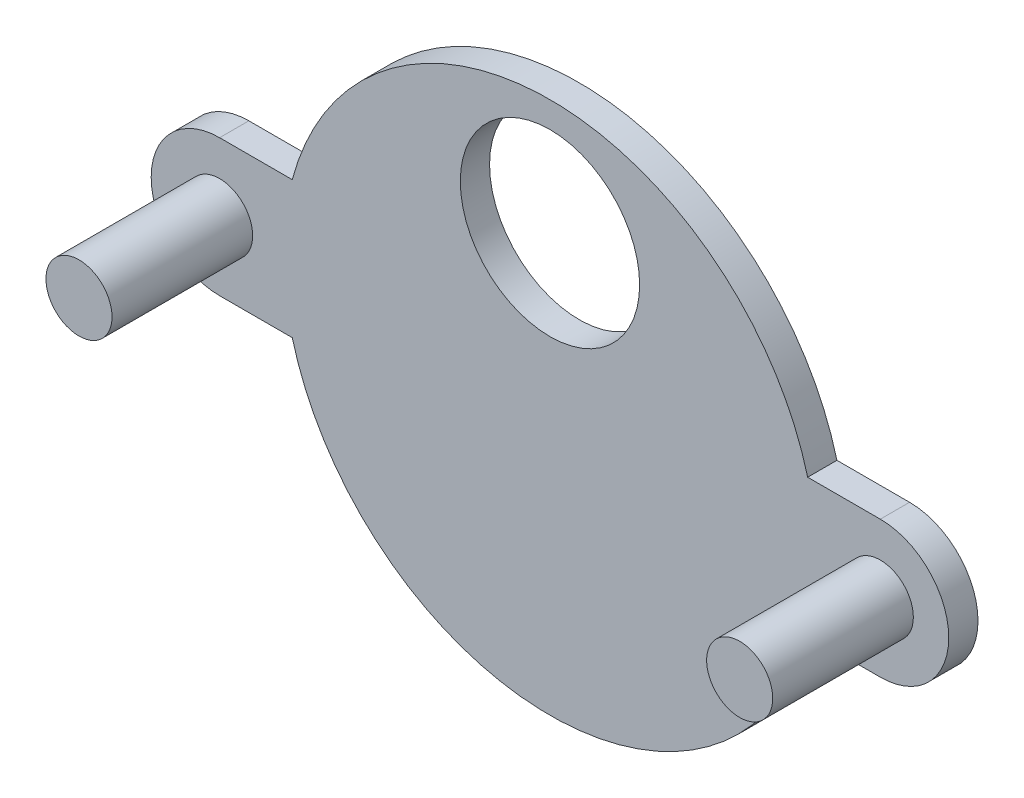
ISO-10303-21;
HEADER;
FILE_DESCRIPTION(('STEP AP214'),'2;1');
FILE_NAME('part.step','',(''),(''),'','','');
FILE_SCHEMA(('AUTOMOTIVE_DESIGN { 1 0 10303 214 1 1 1 1 }'));
ENDSEC;
DATA;
#1=APPLICATION_CONTEXT('core data for automotive mechanical design processes');
#2=APPLICATION_PROTOCOL_DEFINITION('international standard','automotive_design',2000,#1);
#3=PRODUCT_CONTEXT('',#1,'mechanical');
#4=PRODUCT('Part','Part','',(#3));
#5=PRODUCT_RELATED_PRODUCT_CATEGORY('part','',(#4));
#6=PRODUCT_DEFINITION_FORMATION('','',#4);
#7=PRODUCT_DEFINITION_CONTEXT('part definition',#1,'design');
#8=PRODUCT_DEFINITION('design','',#6,#7);
#9=PRODUCT_DEFINITION_SHAPE('','',#8);
#10=(LENGTH_UNIT() NAMED_UNIT(*) SI_UNIT(.MILLI.,.METRE.));
#11=(NAMED_UNIT(*) PLANE_ANGLE_UNIT() SI_UNIT($,.RADIAN.));
#12=(NAMED_UNIT(*) SI_UNIT($,.STERADIAN.) SOLID_ANGLE_UNIT());
#13=UNCERTAINTY_MEASURE_WITH_UNIT(LENGTH_MEASURE(1.E-05),#10,'distance_accuracy_value','');
#14=(GEOMETRIC_REPRESENTATION_CONTEXT(3) GLOBAL_UNCERTAINTY_ASSIGNED_CONTEXT((#13)) GLOBAL_UNIT_ASSIGNED_CONTEXT((#10,
#11,#12)) REPRESENTATION_CONTEXT('',''));
#15=CARTESIAN_POINT('',(0.,0.,0.));
#16=DIRECTION('',(0.,0.,1.));
#17=DIRECTION('',(1.,0.,0.));
#18=AXIS2_PLACEMENT_3D('',#15,#16,#17);
#19=CARTESIAN_POINT('',(0.,0.,1.55));
#20=DIRECTION('',(0.,0.,-1.));
#21=DIRECTION('',(-1.,0.,0.));
#22=AXIS2_PLACEMENT_3D('',#19,#20,#21);
#23=CYLINDRICAL_SURFACE('',#22,14.125);
#24=DIRECTION('',(0.,0.,-1.));
#25=VECTOR('',#24,1.);
#26=CARTESIAN_POINT('',(13.651922941476,-3.625,1.55));
#27=LINE('',#26,#25);
#28=CARTESIAN_POINT('',(13.651922941476,-3.625,1.55));
#29=VERTEX_POINT('',#28);
#30=CARTESIAN_POINT('',(13.651922941476,-3.625,0.));
#31=VERTEX_POINT('',#30);
#32=EDGE_CURVE('E147',#29,#31,#27,.T.);
#33=ORIENTED_EDGE('',*,*,#32,.F.);
#34=CARTESIAN_POINT('',(0.,0.,1.55));
#35=DIRECTION('',(0.,0.,1.));
#36=DIRECTION('',(1.,0.,0.));
#37=AXIS2_PLACEMENT_3D('',#34,#35,#36);
#38=CIRCLE('',#37,14.125);
#39=CARTESIAN_POINT('',(-13.651922941476,-3.625,1.55));
#40=VERTEX_POINT('',#39);
#41=EDGE_CURVE('E47',#40,#29,#38,.T.);
#42=ORIENTED_EDGE('',*,*,#41,.F.);
#43=DIRECTION('',(0.,0.,-1.));
#44=VECTOR('',#43,1.);
#45=CARTESIAN_POINT('',(-13.651922941476,-3.625,1.55));
#46=LINE('',#45,#44);
#47=CARTESIAN_POINT('',(-13.651922941476,-3.625,0.));
#48=VERTEX_POINT('',#47);
#49=EDGE_CURVE('E145',#48,#40,#46,.F.);
#50=ORIENTED_EDGE('',*,*,#49,.F.);
#51=CARTESIAN_POINT('',(0.,0.,0.));
#52=DIRECTION('',(0.,0.,1.));
#53=DIRECTION('',(1.,0.,0.));
#54=AXIS2_PLACEMENT_3D('',#51,#52,#53);
#55=CIRCLE('',#54,14.125);
#56=EDGE_CURVE('E148',#48,#31,#55,.T.);
#57=ORIENTED_EDGE('',*,*,#56,.T.);
#58=EDGE_LOOP('',(#33,#42,#50,#57));
#59=FACE_BOUND('',#58,.T.);
#60=ADVANCED_FACE('F39',(#59),#23,.T.);
#61=DIRECTION('',(0.,0.,-1.));
#62=VECTOR('',#61,1.);
#63=CARTESIAN_POINT('',(-13.651922941476,3.625,1.55));
#64=LINE('',#63,#62);
#65=CARTESIAN_POINT('',(-13.651922941476,3.625,1.55));
#66=VERTEX_POINT('',#65);
#67=CARTESIAN_POINT('',(-13.651922941476,3.625,0.));
#68=VERTEX_POINT('',#67);
#69=EDGE_CURVE('E126',#66,#68,#64,.T.);
#70=ORIENTED_EDGE('',*,*,#69,.F.);
#71=CARTESIAN_POINT('',(13.651922941476,3.625,1.55));
#72=VERTEX_POINT('',#71);
#73=EDGE_CURVE('E11',#72,#66,#38,.T.);
#74=ORIENTED_EDGE('',*,*,#73,.F.);
#75=DIRECTION('',(0.,0.,-1.));
#76=VECTOR('',#75,1.);
#77=CARTESIAN_POINT('',(13.651922941476,3.625,1.55));
#78=LINE('',#77,#76);
#79=CARTESIAN_POINT('',(13.651922941476,3.625,0.));
#80=VERTEX_POINT('',#79);
#81=EDGE_CURVE('E118',#80,#72,#78,.F.);
#82=ORIENTED_EDGE('',*,*,#81,.F.);
#83=EDGE_CURVE('E42',#80,#68,#55,.T.);
#84=ORIENTED_EDGE('',*,*,#83,.T.);
#85=EDGE_LOOP('',(#70,#74,#82,#84));
#86=FACE_BOUND('',#85,.T.);
#87=ADVANCED_FACE('F198',(#86),#23,.T.);
#88=CARTESIAN_POINT('',(0.,0.,1.55));
#89=DIRECTION('',(0.,0.,1.));
#90=DIRECTION('',(1.,0.,0.));
#91=AXIS2_PLACEMENT_3D('',#88,#89,#90);
#92=PLANE('',#91);
#93=CARTESIAN_POINT('',(0.,8.,1.55));
#94=DIRECTION('',(0.,0.,1.));
#95=DIRECTION('',(1.,0.,0.));
#96=AXIS2_PLACEMENT_3D('',#93,#94,#95);
#97=CIRCLE('',#96,4.75);
#98=CARTESIAN_POINT('',(4.75,8.,1.55));
#99=VERTEX_POINT('',#98);
#100=EDGE_CURVE('E183',#99,#99,#97,.F.);
#101=ORIENTED_EDGE('',*,*,#100,.T.);
#102=EDGE_LOOP('',(#101));
#103=FACE_BOUND('',#102,.T.);
#104=CARTESIAN_POINT('',(-17.5,0.,1.55));
#105=DIRECTION('',(0.,0.,1.));
#106=DIRECTION('',(1.,0.,0.));
#107=AXIS2_PLACEMENT_3D('',#104,#105,#106);
#108=CIRCLE('',#107,1.75);
#109=CARTESIAN_POINT('',(-15.75,0.,1.55));
#110=VERTEX_POINT('',#109);
#111=EDGE_CURVE('E142',#110,#110,#108,.F.);
#112=ORIENTED_EDGE('',*,*,#111,.T.);
#113=EDGE_LOOP('',(#112));
#114=FACE_BOUND('',#113,.T.);
#115=CARTESIAN_POINT('',(17.5,0.,1.55));
#116=DIRECTION('',(0.,0.,1.));
#117=DIRECTION('',(1.,0.,0.));
#118=AXIS2_PLACEMENT_3D('',#115,#116,#117);
#119=CIRCLE('',#118,1.75);
#120=CARTESIAN_POINT('',(19.25,0.,1.55));
#121=VERTEX_POINT('',#120);
#122=EDGE_CURVE('E173',#121,#121,#119,.F.);
#123=ORIENTED_EDGE('',*,*,#122,.T.);
#124=EDGE_LOOP('',(#123));
#125=FACE_BOUND('',#124,.T.);
#126=ORIENTED_EDGE('',*,*,#73,.T.);
#127=DIRECTION('',(-1.,0.,0.));
#128=VECTOR('',#127,1.);
#129=CARTESIAN_POINT('',(-17.5,3.625,1.55));
#130=LINE('',#129,#128);
#131=CARTESIAN_POINT('',(-17.5,3.625,1.55));
#132=VERTEX_POINT('',#131);
#133=EDGE_CURVE('E121',#66,#132,#130,.T.);
#134=ORIENTED_EDGE('',*,*,#133,.T.);
#135=CARTESIAN_POINT('',(-17.5,0.,1.55));
#136=DIRECTION('',(0.,0.,1.));
#137=DIRECTION('',(1.,0.,0.));
#138=AXIS2_PLACEMENT_3D('',#135,#136,#137);
#139=CIRCLE('',#138,3.625);
#140=CARTESIAN_POINT('',(-17.5,-3.625,1.55));
#141=VERTEX_POINT('',#140);
#142=EDGE_CURVE('E120',#132,#141,#139,.T.);
#143=ORIENTED_EDGE('',*,*,#142,.T.);
#144=DIRECTION('',(1.,0.,0.));
#145=VECTOR('',#144,1.);
#146=CARTESIAN_POINT('',(-17.5,-3.625,1.55));
#147=LINE('',#146,#145);
#148=EDGE_CURVE('E54',#141,#40,#147,.T.);
#149=ORIENTED_EDGE('',*,*,#148,.T.);
#150=ORIENTED_EDGE('',*,*,#41,.T.);
#151=CARTESIAN_POINT('',(17.5,-3.625,1.55));
#152=VERTEX_POINT('',#151);
#153=EDGE_CURVE('E124',#29,#152,#147,.T.);
#154=ORIENTED_EDGE('',*,*,#153,.T.);
#155=CARTESIAN_POINT('',(17.5,0.,1.55));
#156=DIRECTION('',(0.,0.,1.));
#157=DIRECTION('',(1.,0.,0.));
#158=AXIS2_PLACEMENT_3D('',#155,#156,#157);
#159=CIRCLE('',#158,3.625);
#160=CARTESIAN_POINT('',(17.5,3.625,1.55));
#161=VERTEX_POINT('',#160);
#162=EDGE_CURVE('E108',#152,#161,#159,.T.);
#163=ORIENTED_EDGE('',*,*,#162,.T.);
#164=EDGE_CURVE('E60',#161,#72,#130,.T.);
#165=ORIENTED_EDGE('',*,*,#164,.T.);
#166=EDGE_LOOP('',(#126,#134,#143,#149,#150,#154,#163,#165));
#167=FACE_BOUND('',#166,.T.);
#168=ADVANCED_FACE('F123',(#103,#114,#125,#167),#92,.T.);
#169=CARTESIAN_POINT('',(0.,0.,0.));
#170=DIRECTION('',(0.,0.,1.));
#171=DIRECTION('',(1.,0.,0.));
#172=AXIS2_PLACEMENT_3D('',#169,#170,#171);
#173=PLANE('',#172);
#174=CARTESIAN_POINT('',(0.,8.,0.));
#175=DIRECTION('',(0.,0.,-1.));
#176=DIRECTION('',(-1.,0.,0.));
#177=AXIS2_PLACEMENT_3D('',#174,#175,#176);
#178=CIRCLE('',#177,4.75);
#179=CARTESIAN_POINT('',(-4.75,8.,0.));
#180=VERTEX_POINT('',#179);
#181=EDGE_CURVE('E180',#180,#180,#178,.T.);
#182=ORIENTED_EDGE('',*,*,#181,.F.);
#183=EDGE_LOOP('',(#182));
#184=FACE_BOUND('',#183,.T.);
#185=ORIENTED_EDGE('',*,*,#83,.F.);
#186=DIRECTION('',(-1.,0.,0.));
#187=VECTOR('',#186,1.);
#188=CARTESIAN_POINT('',(-17.5,3.625,0.));
#189=LINE('',#188,#187);
#190=CARTESIAN_POINT('',(17.5,3.625,0.));
#191=VERTEX_POINT('',#190);
#192=EDGE_CURVE('E169',#191,#80,#189,.T.);
#193=ORIENTED_EDGE('',*,*,#192,.F.);
#194=CARTESIAN_POINT('',(17.5,0.,0.));
#195=DIRECTION('',(0.,0.,1.));
#196=DIRECTION('',(1.,0.,0.));
#197=AXIS2_PLACEMENT_3D('',#194,#195,#196);
#198=CIRCLE('',#197,3.625);
#199=CARTESIAN_POINT('',(17.5,-3.625,0.));
#200=VERTEX_POINT('',#199);
#201=EDGE_CURVE('E111',#200,#191,#198,.T.);
#202=ORIENTED_EDGE('',*,*,#201,.F.);
#203=DIRECTION('',(1.,0.,0.));
#204=VECTOR('',#203,1.);
#205=CARTESIAN_POINT('',(-17.5,-3.625,0.));
#206=LINE('',#205,#204);
#207=EDGE_CURVE('E136',#31,#200,#206,.T.);
#208=ORIENTED_EDGE('',*,*,#207,.F.);
#209=ORIENTED_EDGE('',*,*,#56,.F.);
#210=CARTESIAN_POINT('',(-17.5,-3.625,0.));
#211=VERTEX_POINT('',#210);
#212=EDGE_CURVE('E138',#211,#48,#206,.T.);
#213=ORIENTED_EDGE('',*,*,#212,.F.);
#214=CARTESIAN_POINT('',(-17.5,0.,0.));
#215=DIRECTION('',(0.,0.,1.));
#216=DIRECTION('',(1.,0.,0.));
#217=AXIS2_PLACEMENT_3D('',#214,#215,#216);
#218=CIRCLE('',#217,3.625);
#219=CARTESIAN_POINT('',(-17.5,3.625,0.));
#220=VERTEX_POINT('',#219);
#221=EDGE_CURVE('E130',#220,#211,#218,.T.);
#222=ORIENTED_EDGE('',*,*,#221,.F.);
#223=EDGE_CURVE('E114',#68,#220,#189,.T.);
#224=ORIENTED_EDGE('',*,*,#223,.F.);
#225=EDGE_LOOP('',(#185,#193,#202,#208,#209,#213,#222,#224));
#226=FACE_BOUND('',#225,.T.);
#227=ADVANCED_FACE('F164',(#184,#226),#173,.F.);
#228=CARTESIAN_POINT('',(17.5,0.,44.4175285035189));
#229=DIRECTION('',(0.,0.,-1.));
#230=DIRECTION('',(-1.,0.,0.));
#231=AXIS2_PLACEMENT_3D('',#228,#229,#230);
#232=CYLINDRICAL_SURFACE('',#231,3.625);
#233=ORIENTED_EDGE('',*,*,#162,.F.);
#234=DIRECTION('',(0.,0.,-1.));
#235=VECTOR('',#234,1.);
#236=CARTESIAN_POINT('',(17.5,-3.625,44.4175285035189));
#237=LINE('',#236,#235);
#238=EDGE_CURVE('E137',#152,#200,#237,.T.);
#239=ORIENTED_EDGE('',*,*,#238,.T.);
#240=ORIENTED_EDGE('',*,*,#201,.T.);
#241=DIRECTION('',(0.,0.,-1.));
#242=VECTOR('',#241,1.);
#243=CARTESIAN_POINT('',(17.5,3.625,44.4175285035189));
#244=LINE('',#243,#242);
#245=EDGE_CURVE('E105',#161,#191,#244,.T.);
#246=ORIENTED_EDGE('',*,*,#245,.F.);
#247=EDGE_LOOP('',(#233,#239,#240,#246));
#248=FACE_BOUND('',#247,.T.);
#249=ADVANCED_FACE('F106',(#248),#232,.T.);
#250=CARTESIAN_POINT('',(-17.5,3.625,44.4175285035189));
#251=DIRECTION('',(0.,-1.,0.));
#252=DIRECTION('',(0.,0.,-1.));
#253=AXIS2_PLACEMENT_3D('',#250,#251,#252);
#254=PLANE('',#253);
#255=ORIENTED_EDGE('',*,*,#192,.T.);
#256=ORIENTED_EDGE('',*,*,#81,.T.);
#257=ORIENTED_EDGE('',*,*,#164,.F.);
#258=ORIENTED_EDGE('',*,*,#245,.T.);
#259=EDGE_LOOP('',(#255,#256,#257,#258));
#260=FACE_BOUND('',#259,.T.);
#261=ADVANCED_FACE('F116',(#260),#254,.F.);
#262=CARTESIAN_POINT('',(-17.5,-3.625,44.4175285035189));
#263=DIRECTION('',(0.,1.,0.));
#264=DIRECTION('',(0.,0.,1.));
#265=AXIS2_PLACEMENT_3D('',#262,#263,#264);
#266=PLANE('',#265);
#267=ORIENTED_EDGE('',*,*,#153,.F.);
#268=ORIENTED_EDGE('',*,*,#32,.T.);
#269=ORIENTED_EDGE('',*,*,#207,.T.);
#270=ORIENTED_EDGE('',*,*,#238,.F.);
#271=EDGE_LOOP('',(#267,#268,#269,#270));
#272=FACE_BOUND('',#271,.T.);
#273=ADVANCED_FACE('F217',(#272),#266,.F.);
#274=ORIENTED_EDGE('',*,*,#212,.T.);
#275=ORIENTED_EDGE('',*,*,#49,.T.);
#276=ORIENTED_EDGE('',*,*,#148,.F.);
#277=DIRECTION('',(0.,0.,-1.));
#278=VECTOR('',#277,1.);
#279=CARTESIAN_POINT('',(-17.5,-3.625,44.4175285035189));
#280=LINE('',#279,#278);
#281=EDGE_CURVE('E134',#141,#211,#280,.T.);
#282=ORIENTED_EDGE('',*,*,#281,.T.);
#283=EDGE_LOOP('',(#274,#275,#276,#282));
#284=FACE_BOUND('',#283,.T.);
#285=ADVANCED_FACE('F215',(#284),#266,.F.);
#286=ORIENTED_EDGE('',*,*,#133,.F.);
#287=ORIENTED_EDGE('',*,*,#69,.T.);
#288=ORIENTED_EDGE('',*,*,#223,.T.);
#289=DIRECTION('',(0.,0.,-1.));
#290=VECTOR('',#289,1.);
#291=CARTESIAN_POINT('',(-17.5,3.625,44.4175285035189));
#292=LINE('',#291,#290);
#293=EDGE_CURVE('E140',#132,#220,#292,.T.);
#294=ORIENTED_EDGE('',*,*,#293,.F.);
#295=EDGE_LOOP('',(#286,#287,#288,#294));
#296=FACE_BOUND('',#295,.T.);
#297=ADVANCED_FACE('F211',(#296),#254,.F.);
#298=CARTESIAN_POINT('',(-17.5,0.,44.4175285035189));
#299=DIRECTION('',(0.,0.,-1.));
#300=DIRECTION('',(-1.,0.,0.));
#301=AXIS2_PLACEMENT_3D('',#298,#299,#300);
#302=CYLINDRICAL_SURFACE('',#301,3.625);
#303=ORIENTED_EDGE('',*,*,#142,.F.);
#304=ORIENTED_EDGE('',*,*,#293,.T.);
#305=ORIENTED_EDGE('',*,*,#221,.T.);
#306=ORIENTED_EDGE('',*,*,#281,.F.);
#307=EDGE_LOOP('',(#303,#304,#305,#306));
#308=FACE_BOUND('',#307,.T.);
#309=ADVANCED_FACE('F214',(#308),#302,.T.);
#310=CARTESIAN_POINT('',(17.5,0.,9.));
#311=DIRECTION('',(0.,0.,-1.));
#312=DIRECTION('',(-1.,0.,0.));
#313=AXIS2_PLACEMENT_3D('',#310,#311,#312);
#314=CYLINDRICAL_SURFACE('',#313,1.75);
#315=ORIENTED_EDGE('',*,*,#122,.F.);
#316=EDGE_LOOP('',(#315));
#317=FACE_BOUND('',#316,.T.);
#318=CARTESIAN_POINT('',(17.5,0.,9.));
#319=DIRECTION('',(0.,0.,1.));
#320=DIRECTION('',(1.,0.,0.));
#321=AXIS2_PLACEMENT_3D('',#318,#319,#320);
#322=CIRCLE('',#321,1.75);
#323=CARTESIAN_POINT('',(19.25,0.,9.));
#324=VERTEX_POINT('',#323);
#325=EDGE_CURVE('E177',#324,#324,#322,.T.);
#326=ORIENTED_EDGE('',*,*,#325,.F.);
#327=EDGE_LOOP('',(#326));
#328=FACE_BOUND('',#327,.T.);
#329=ADVANCED_FACE('F226',(#317,#328),#314,.T.);
#330=CARTESIAN_POINT('',(17.5,0.,9.));
#331=DIRECTION('',(0.,0.,1.));
#332=DIRECTION('',(1.,0.,0.));
#333=AXIS2_PLACEMENT_3D('',#330,#331,#332);
#334=PLANE('',#333);
#335=ORIENTED_EDGE('',*,*,#325,.T.);
#336=EDGE_LOOP('',(#335));
#337=FACE_BOUND('',#336,.T.);
#338=ADVANCED_FACE('F230',(#337),#334,.T.);
#339=CARTESIAN_POINT('',(-17.5,0.,9.));
#340=DIRECTION('',(0.,0.,-1.));
#341=DIRECTION('',(-1.,0.,0.));
#342=AXIS2_PLACEMENT_3D('',#339,#340,#341);
#343=CYLINDRICAL_SURFACE('',#342,1.75);
#344=ORIENTED_EDGE('',*,*,#111,.F.);
#345=EDGE_LOOP('',(#344));
#346=FACE_BOUND('',#345,.T.);
#347=CARTESIAN_POINT('',(-17.5,0.,9.));
#348=DIRECTION('',(0.,0.,1.));
#349=DIRECTION('',(1.,0.,0.));
#350=AXIS2_PLACEMENT_3D('',#347,#348,#349);
#351=CIRCLE('',#350,1.75);
#352=CARTESIAN_POINT('',(-15.75,0.,9.));
#353=VERTEX_POINT('',#352);
#354=EDGE_CURVE('E176',#353,#353,#351,.T.);
#355=ORIENTED_EDGE('',*,*,#354,.F.);
#356=EDGE_LOOP('',(#355));
#357=FACE_BOUND('',#356,.T.);
#358=ADVANCED_FACE('F236',(#346,#357),#343,.T.);
#359=CARTESIAN_POINT('',(-17.5,0.,9.));
#360=DIRECTION('',(0.,0.,1.));
#361=DIRECTION('',(1.,0.,0.));
#362=AXIS2_PLACEMENT_3D('',#359,#360,#361);
#363=PLANE('',#362);
#364=ORIENTED_EDGE('',*,*,#354,.T.);
#365=EDGE_LOOP('',(#364));
#366=FACE_BOUND('',#365,.T.);
#367=ADVANCED_FACE('F244',(#366),#363,.T.);
#368=CARTESIAN_POINT('',(0.,8.,9.001));
#369=DIRECTION('',(0.,0.,-1.));
#370=DIRECTION('',(-1.,0.,0.));
#371=AXIS2_PLACEMENT_3D('',#368,#369,#370);
#372=CYLINDRICAL_SURFACE('',#371,4.75);
#373=ORIENTED_EDGE('',*,*,#100,.F.);
#374=EDGE_LOOP('',(#373));
#375=FACE_BOUND('',#374,.T.);
#376=ORIENTED_EDGE('',*,*,#181,.T.);
#377=EDGE_LOOP('',(#376));
#378=FACE_BOUND('',#377,.T.);
#379=ADVANCED_FACE('F189',(#375,#378),#372,.F.);
#380=CLOSED_SHELL('',(#60,#87,#168,#227,#249,#261,#273,#285,#297,#309,#329,#338,#358,#367,#379));
#381=MANIFOLD_SOLID_BREP('B2',#380);
#382=ADVANCED_BREP_SHAPE_REPRESENTATION('',(#18,#381),#14);
#383=SHAPE_DEFINITION_REPRESENTATION(#9,#382);
ENDSEC;
END-ISO-10303-21;
